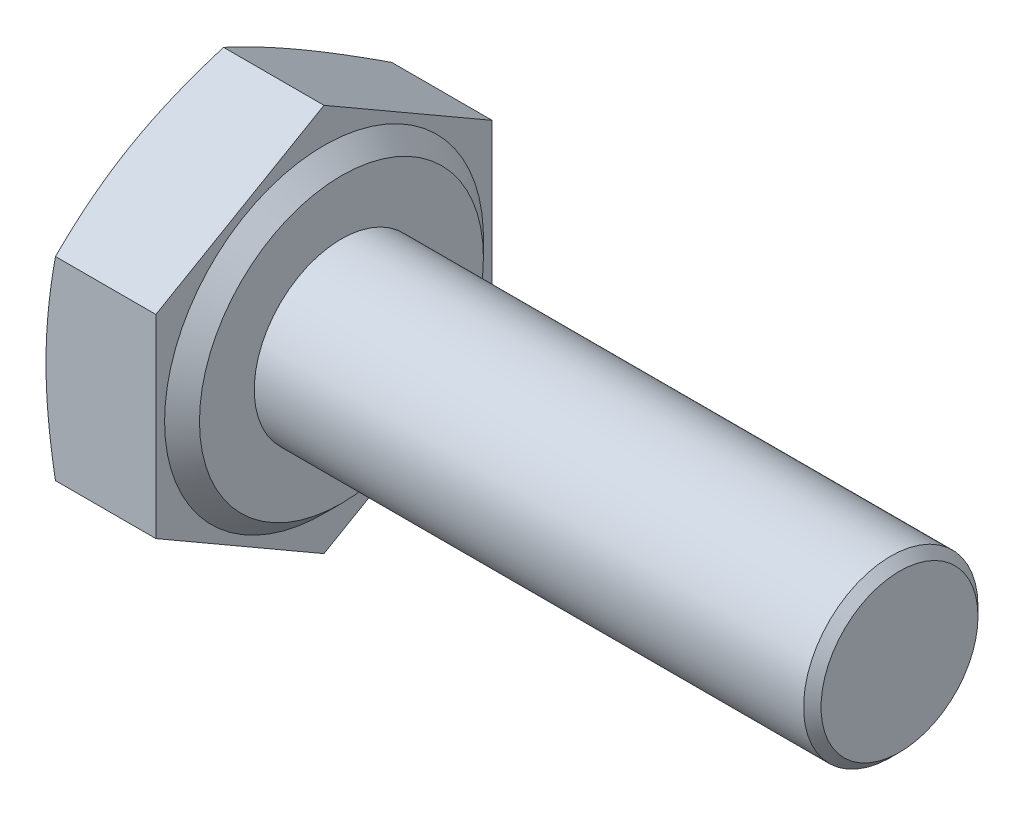
ISO-10303-21;
HEADER;
FILE_DESCRIPTION(('STEP AP214'),'2;1');
FILE_NAME('part.step','',(''),(''),'','','');
FILE_SCHEMA(('AUTOMOTIVE_DESIGN { 1 0 10303 214 1 1 1 1 }'));
ENDSEC;
DATA;
#1=APPLICATION_CONTEXT('core data for automotive mechanical design processes');
#2=APPLICATION_PROTOCOL_DEFINITION('international standard','automotive_design',2000,#1);
#3=PRODUCT_CONTEXT('',#1,'mechanical');
#4=PRODUCT('Part','Part','',(#3));
#5=PRODUCT_RELATED_PRODUCT_CATEGORY('part','',(#4));
#6=PRODUCT_DEFINITION_FORMATION('','',#4);
#7=PRODUCT_DEFINITION_CONTEXT('part definition',#1,'design');
#8=PRODUCT_DEFINITION('design','',#6,#7);
#9=PRODUCT_DEFINITION_SHAPE('','',#8);
#10=(LENGTH_UNIT() NAMED_UNIT(*) SI_UNIT(.MILLI.,.METRE.));
#11=(NAMED_UNIT(*) PLANE_ANGLE_UNIT() SI_UNIT($,.RADIAN.));
#12=(NAMED_UNIT(*) SI_UNIT($,.STERADIAN.) SOLID_ANGLE_UNIT());
#13=UNCERTAINTY_MEASURE_WITH_UNIT(LENGTH_MEASURE(1.E-05),#10,'distance_accuracy_value','');
#14=(GEOMETRIC_REPRESENTATION_CONTEXT(3) GLOBAL_UNCERTAINTY_ASSIGNED_CONTEXT((#13)) GLOBAL_UNIT_ASSIGNED_CONTEXT((#10,
#11,#12)) REPRESENTATION_CONTEXT('',''));
#15=CARTESIAN_POINT('',(0.,0.,0.));
#16=DIRECTION('',(0.,0.,1.));
#17=DIRECTION('',(1.,0.,0.));
#18=AXIS2_PLACEMENT_3D('',#15,#16,#17);
#19=CARTESIAN_POINT('',(1.825,-1.391414148747,-2.41));
#20=DIRECTION('',(1.,0.,0.));
#21=DIRECTION('',(0.,0.,-1.));
#22=AXIS2_PLACEMENT_3D('',#19,#20,#21);
#23=PLANE('',#22);
#24=CARTESIAN_POINT('',(1.825,0.,0.));
#25=DIRECTION('',(-1.,0.,0.));
#26=DIRECTION('',(0.,0.,1.));
#27=AXIS2_PLACEMENT_3D('',#24,#25,#26);
#28=CIRCLE('',#27,2.035);
#29=CARTESIAN_POINT('',(1.825,0.,2.035));
#30=VERTEX_POINT('',#29);
#31=EDGE_CURVE('E288',#30,#30,#28,.T.);
#32=ORIENTED_EDGE('',*,*,#31,.F.);
#33=EDGE_LOOP('',(#32));
#34=FACE_BOUND('',#33,.T.);
#35=CARTESIAN_POINT('',(1.825,0.,0.));
#36=DIRECTION('',(1.,0.,0.));
#37=DIRECTION('',(0.,0.,-1.));
#38=AXIS2_PLACEMENT_3D('',#35,#36,#37);
#39=CIRCLE('',#38,1.25);
#40=CARTESIAN_POINT('',(1.825,0.,-1.25));
#41=VERTEX_POINT('',#40);
#42=EDGE_CURVE('E296',#41,#41,#39,.T.);
#43=ORIENTED_EDGE('',*,*,#42,.F.);
#44=EDGE_LOOP('',(#43));
#45=FACE_BOUND('',#44,.T.);
#46=ADVANCED_FACE('F37',(#34,#45),#23,.T.);
#47=CARTESIAN_POINT('',(1.825,-2.782828297494,0.));
#48=DIRECTION('',(0.,0.866025403784439,0.5));
#49=DIRECTION('',(0.,-0.5,0.866025403784439));
#50=AXIS2_PLACEMENT_3D('',#47,#48,#49);
#51=PLANE('',#50);
#52=CARTESIAN_POINT('',(0.135740433058224,-1.39129867869316,-2.4102));
#53=CARTESIAN_POINT('',(0.11475495777836,-1.44892969610211,-2.31038014975582));
#54=CARTESIAN_POINT('',(0.0956649105607363,-1.50675077673671,-2.21023110034815));
#55=CARTESIAN_POINT('',(0.0620787721126977,-1.6227689600018,-2.00928171233119));
#56=CARTESIAN_POINT('',(0.0475862770157083,-1.68096632082732,-1.90848092651496));
#57=CARTESIAN_POINT('',(0.0241450259654417,-1.797091094461,-1.707346918564));
#58=CARTESIAN_POINT('',(0.0151451325515843,-1.85501585427782,-1.60701829154504));
#59=CARTESIAN_POINT('',(0.00307373147167732,-1.97100085644315,-1.40612637487869));
#60=CARTESIAN_POINT('',(0.,-2.02906103978183,-1.30556318743935));
#61=CARTESIAN_POINT('',(0.,-2.14518140645917,-1.10443681256065));
#62=CARTESIAN_POINT('',(0.00307373147167722,-2.20324158979785,-1.00387362512131));
#63=CARTESIAN_POINT('',(0.0151451325515843,-2.31922659196318,-0.802981708454963));
#64=CARTESIAN_POINT('',(0.0241450259654417,-2.37715135178,-0.702653081436003));
#65=CARTESIAN_POINT('',(0.0475862770157085,-2.49327612541368,-0.501519073485041));
#66=CARTESIAN_POINT('',(0.0620787721126978,-2.5514734862392,-0.400718287668812));
#67=CARTESIAN_POINT('',(0.0956649105607365,-2.66749166950428,-0.199768899651853));
#68=CARTESIAN_POINT('',(0.11475495777836,-2.72531275013889,-0.099619850244179));
#69=CARTESIAN_POINT('',(0.135740433058224,-2.78294376754784,0.000200000000000868));
#70=B_SPLINE_CURVE_WITH_KNOTS('',3,(#52,#53,#54,#55,#56,#57,#58,#59,#60,#61,#62,#63,#64,#65,#66,
#67,#68,#69),.UNSPECIFIED.,.F.,.F.,(4,2,2,2,2,2,2,2,4),(0.,0.351506811172691,0.703287891421606,
1.05174174717387,1.40006481936204,1.7483878915502,2.09684174730247,2.44862282755138,
2.80012963872407),.UNSPECIFIED.);
#71=CARTESIAN_POINT('',(0.135698402779957,-1.391414148747,-2.41));
#72=VERTEX_POINT('',#71);
#73=CARTESIAN_POINT('',(0.,-2.0871212231205,-1.205));
#74=VERTEX_POINT('',#73);
#75=EDGE_CURVE('E115',#72,#74,#70,.T.);
#76=ORIENTED_EDGE('',*,*,#75,.F.);
#77=DIRECTION('',(-1.,0.,0.));
#78=VECTOR('',#77,1.);
#79=CARTESIAN_POINT('',(1.825,-1.391414148747,-2.41));
#80=LINE('',#79,#78);
#81=CARTESIAN_POINT('',(1.575,-1.391414148747,-2.41));
#82=VERTEX_POINT('',#81);
#83=EDGE_CURVE('E144',#82,#72,#80,.T.);
#84=ORIENTED_EDGE('',*,*,#83,.F.);
#85=DIRECTION('',(0.,0.5,-0.866025403784439));
#86=VECTOR('',#85,1.);
#87=CARTESIAN_POINT('',(1.575,-2.782828297494,0.));
#88=LINE('',#87,#86);
#89=CARTESIAN_POINT('',(1.575,-2.782828297494,0.));
#90=VERTEX_POINT('',#89);
#91=EDGE_CURVE('E273',#90,#82,#88,.T.);
#92=ORIENTED_EDGE('',*,*,#91,.F.);
#93=DIRECTION('',(-1.,0.,0.));
#94=VECTOR('',#93,1.);
#95=CARTESIAN_POINT('',(1.825,-2.782828297494,0.));
#96=LINE('',#95,#94);
#97=CARTESIAN_POINT('',(0.135698402779957,-2.782828297494,0.));
#98=VERTEX_POINT('',#97);
#99=EDGE_CURVE('E138',#90,#98,#96,.T.);
#100=ORIENTED_EDGE('',*,*,#99,.T.);
#101=EDGE_CURVE('E168',#74,#98,#70,.T.);
#102=ORIENTED_EDGE('',*,*,#101,.F.);
#103=EDGE_LOOP('',(#76,#84,#92,#100,#102));
#104=FACE_BOUND('',#103,.T.);
#105=ADVANCED_FACE('F183',(#104),#51,.F.);
#106=CARTESIAN_POINT('',(1.825,-1.391414148747,-2.41));
#107=DIRECTION('',(0.,0.,1.));
#108=DIRECTION('',(1.,0.,0.));
#109=AXIS2_PLACEMENT_3D('',#106,#107,#108);
#110=PLANE('',#109);
#111=CARTESIAN_POINT('',(0.725118449395189,-3.68397541103632,-2.41));
#112=CARTESIAN_POINT('',(0.691916232197405,-3.57493826236735,-2.41));
#113=CARTESIAN_POINT('',(0.659102121100284,-3.46578099905647,-2.41));
#114=CARTESIAN_POINT('',(0.594463062521044,-3.24716497102925,-2.41));
#115=CARTESIAN_POINT('',(0.562638193311904,-3.13770618319719,-2.41));
#116=CARTESIAN_POINT('',(0.500137627974855,-2.9182384834956,-2.41));
#117=CARTESIAN_POINT('',(0.469464186700084,-2.80822892626066,-2.41));
#118=CARTESIAN_POINT('',(0.409632431370639,-2.58780097616611,-2.41));
#119=CARTESIAN_POINT('',(0.380474090111957,-2.47738259068526,-2.41));
#120=CARTESIAN_POINT('',(0.296492088804014,-2.14814022690301,-2.41));
#121=CARTESIAN_POINT('',(0.244371129606403,-1.92861379638917,-2.41));
#122=CARTESIAN_POINT('',(0.151484728591024,-1.48714341669105,-2.41));
#123=CARTESIAN_POINT('',(0.110714498866752,-1.26520052798119,-2.41));
#124=CARTESIAN_POINT('',(0.0641696067607395,-0.942929633412358,-2.41));
#125=CARTESIAN_POINT('',(0.0515408433248546,-0.84359294154322,-2.41));
#126=CARTESIAN_POINT('',(0.0301655451002474,-0.644507733033792,-2.41));
#127=CARTESIAN_POINT('',(0.0214185279129786,-0.544759269121795,-2.41));
#128=CARTESIAN_POINT('',(0.00822428799543366,-0.345040250399277,-2.41));
#129=CARTESIAN_POINT('',(0.00377422786066022,-0.245069885895629,-2.41));
#130=CARTESIAN_POINT('',(-0.000599632618072343,-0.0450290569932735,-2.41));
#131=CARTESIAN_POINT('',(-0.000523464925827476,0.0550414066935534,-2.41));
#132=CARTESIAN_POINT('',(0.00416262453057698,0.255580348418417,-2.41));
#133=CARTESIAN_POINT('',(0.00879545593826702,0.35604828220074,-2.41));
#134=CARTESIAN_POINT('',(0.0223820785581514,0.55669255580445,-2.41));
#135=CARTESIAN_POINT('',(0.0313361280323531,0.65686887783731,-2.41));
#136=CARTESIAN_POINT('',(0.0531452391923551,0.856875508901907,-2.41));
#137=CARTESIAN_POINT('',(0.0660035820186058,0.956705455193562,-2.41));
#138=CARTESIAN_POINT('',(0.0951032470303854,1.1558645767854,-2.41));
#139=CARTESIAN_POINT('',(0.111344587347389,1.25519374939872,-2.41));
#140=CARTESIAN_POINT('',(0.16619784536191,1.56289258023904,-2.41));
#141=CARTESIAN_POINT('',(0.209688553620053,1.77039003827092,-2.41));
#142=CARTESIAN_POINT('',(0.305040033571945,2.18345797478288,-2.41));
#143=CARTESIAN_POINT('',(0.356903819988952,2.38902773088139,-2.41));
#144=CARTESIAN_POINT('',(0.466211254341441,2.79894891337343,-2.41));
#145=CARTESIAN_POINT('',(0.523662035140416,3.00329841923893,-2.41));
#146=CARTESIAN_POINT('',(0.642259494800449,3.41087605095134,-2.41));
#147=CARTESIAN_POINT('',(0.703405587237117,3.61410434917033,-2.41));
#148=CARTESIAN_POINT('',(0.827565869995835,4.0175314782658,-2.41));
#149=CARTESIAN_POINT('',(0.890551990666702,4.21773898772082,-2.41));
#150=CARTESIAN_POINT('',(1.01831333910352,4.61759102111228,-2.41));
#151=CARTESIAN_POINT('',(1.08308865270908,4.817235517529,-2.41));
#152=CARTESIAN_POINT('',(1.21369513300691,5.21533887704352,-2.41));
#153=CARTESIAN_POINT('',(1.27952136084416,5.41379936454835,-2.41));
#154=CARTESIAN_POINT('',(1.41216077369734,5.81037235612901,-2.41));
#155=CARTESIAN_POINT('',(1.47897387697604,6.00848488752012,-2.41));
#156=CARTESIAN_POINT('',(1.54613224071265,6.20647862211173,-2.41));
#157=B_SPLINE_CURVE_WITH_KNOTS('',3,(#111,#112,#113,#114,#115,#116,#117,#118,#119,#120,#121,
#122,#123,#124,#125,#126,#127,#128,#129,#130,#131,#132,#133,#134,#135,#136,#137,#138,#139,#140,
#141,#142,#143,#144,#145,#146,#147,#148,#149,#150,#151,#152,#153,#154,#155,#156),.UNSPECIFIED.,
.F.,.F.,(4,2,2,2,2,2,2,2,2,2,2,2,2,2,2,2,2,2,2,2,2,2,4),(0.,0.34194254467835,0.683912076771967,
1.02651963861704,1.36912104672901,2.04584380108136,2.72228066972418,3.02262592336229,
3.32293384155769,3.62304332189978,3.92315068289714,4.22477465382139,4.52641665384296,
4.82831285659151,5.13021067742115,5.76592006074203,6.4018588435226,7.03862045696581,
7.67528128406269,8.30491470768854,8.93457839170694,9.56185291021376,10.1890757632936),.UNSPECIFIED.);
#158=CARTESIAN_POINT('',(0.135698402779957,1.391414148747,-2.41));
#159=VERTEX_POINT('',#158);
#160=CARTESIAN_POINT('',(0.,0.,-2.41));
#161=VERTEX_POINT('',#160);
#162=EDGE_CURVE('E233',#159,#161,#157,.F.);
#163=ORIENTED_EDGE('',*,*,#162,.F.);
#164=DIRECTION('',(-1.,0.,0.));
#165=VECTOR('',#164,1.);
#166=CARTESIAN_POINT('',(1.825,1.391414148747,-2.41));
#167=LINE('',#166,#165);
#168=CARTESIAN_POINT('',(1.575,1.391414148747,-2.41));
#169=VERTEX_POINT('',#168);
#170=EDGE_CURVE('E135',#169,#159,#167,.T.);
#171=ORIENTED_EDGE('',*,*,#170,.F.);
#172=DIRECTION('',(0.,1.,0.));
#173=VECTOR('',#172,1.);
#174=CARTESIAN_POINT('',(1.575,-1.391414148747,-2.41));
#175=LINE('',#174,#173);
#176=EDGE_CURVE('E275',#82,#169,#175,.T.);
#177=ORIENTED_EDGE('',*,*,#176,.F.);
#178=ORIENTED_EDGE('',*,*,#83,.T.);
#179=EDGE_CURVE('E126',#161,#72,#157,.F.);
#180=ORIENTED_EDGE('',*,*,#179,.F.);
#181=EDGE_LOOP('',(#163,#171,#177,#178,#180));
#182=FACE_BOUND('',#181,.T.);
#183=ADVANCED_FACE('F241',(#182),#110,.F.);
#184=CARTESIAN_POINT('',(1.825,1.391414148747,-2.41));
#185=DIRECTION('',(0.,-0.866025403784439,0.5));
#186=DIRECTION('',(0.,-0.5,-0.866025403784439));
#187=AXIS2_PLACEMENT_3D('',#184,#185,#186);
#188=PLANE('',#187);
#189=CARTESIAN_POINT('',(0.135740433058224,2.78294376754784,0.000200000000000052));
#190=CARTESIAN_POINT('',(0.114754957778361,2.72531275013889,-0.0996198502441798));
#191=CARTESIAN_POINT('',(0.0956649105607367,2.66749166950428,-0.199768899651854));
#192=CARTESIAN_POINT('',(0.0620787721126979,2.5514734862392,-0.400718287668813));
#193=CARTESIAN_POINT('',(0.0475862770157086,2.49327612541368,-0.501519073485042));
#194=CARTESIAN_POINT('',(0.024145025965442,2.37715135178,-0.702653081436003));
#195=CARTESIAN_POINT('',(0.0151451325515847,2.31922659196318,-0.802981708454963));
#196=CARTESIAN_POINT('',(0.00307373147167759,2.20324158979785,-1.00387362512131));
#197=CARTESIAN_POINT('',(0.,2.14518140645917,-1.10443681256065));
#198=CARTESIAN_POINT('',(0.,2.02906103978183,-1.30556318743935));
#199=CARTESIAN_POINT('',(0.00307373147167731,1.97100085644315,-1.40612637487869));
#200=CARTESIAN_POINT('',(0.0151451325515843,1.85501585427782,-1.60701829154504));
#201=CARTESIAN_POINT('',(0.0241450259654417,1.797091094461,-1.707346918564));
#202=CARTESIAN_POINT('',(0.0475862770157083,1.68096632082732,-1.90848092651496));
#203=CARTESIAN_POINT('',(0.0620787721126976,1.6227689600018,-2.00928171233119));
#204=CARTESIAN_POINT('',(0.0956649105607362,1.50675077673671,-2.21023110034815));
#205=CARTESIAN_POINT('',(0.11475495777836,1.44892969610211,-2.31038014975582));
#206=CARTESIAN_POINT('',(0.135740433058224,1.39129867869316,-2.4102));
#207=B_SPLINE_CURVE_WITH_KNOTS('',3,(#189,#190,#191,#192,#193,#194,#195,#196,#197,#198,#199,
#200,#201,#202,#203,#204,#205,#206),.UNSPECIFIED.,.F.,.F.,(4,2,2,2,2,2,2,2,4),(0.,
0.351506811172691,0.703287891421605,1.05174174717387,1.40006481936203,1.7483878915502,
2.09684174730247,2.44862282755138,2.80012963872407),.UNSPECIFIED.);
#208=CARTESIAN_POINT('',(0.135698402779957,2.782828297494,0.));
#209=VERTEX_POINT('',#208);
#210=CARTESIAN_POINT('',(0.,2.0871212231205,-1.205));
#211=VERTEX_POINT('',#210);
#212=EDGE_CURVE('E52',#209,#211,#207,.T.);
#213=ORIENTED_EDGE('',*,*,#212,.F.);
#214=DIRECTION('',(-1.,0.,0.));
#215=VECTOR('',#214,1.);
#216=CARTESIAN_POINT('',(1.825,2.782828297494,0.));
#217=LINE('',#216,#215);
#218=CARTESIAN_POINT('',(1.575,2.782828297494,0.));
#219=VERTEX_POINT('',#218);
#220=EDGE_CURVE('E132',#219,#209,#217,.T.);
#221=ORIENTED_EDGE('',*,*,#220,.F.);
#222=DIRECTION('',(0.,0.5,0.866025403784439));
#223=VECTOR('',#222,1.);
#224=CARTESIAN_POINT('',(1.575,1.391414148747,-2.41));
#225=LINE('',#224,#223);
#226=EDGE_CURVE('E281',#169,#219,#225,.T.);
#227=ORIENTED_EDGE('',*,*,#226,.F.);
#228=ORIENTED_EDGE('',*,*,#170,.T.);
#229=EDGE_CURVE('E234',#211,#159,#207,.T.);
#230=ORIENTED_EDGE('',*,*,#229,.F.);
#231=EDGE_LOOP('',(#213,#221,#227,#228,#230));
#232=FACE_BOUND('',#231,.T.);
#233=ADVANCED_FACE('F244',(#232),#188,.F.);
#234=CARTESIAN_POINT('',(1.825,2.782828297494,0.));
#235=DIRECTION('',(0.,-0.866025403784439,-0.5));
#236=DIRECTION('',(0.,0.5,-0.866025403784439));
#237=AXIS2_PLACEMENT_3D('',#234,#235,#236);
#238=PLANE('',#237);
#239=CARTESIAN_POINT('',(0.135740433058224,1.39129867869316,2.4102));
#240=CARTESIAN_POINT('',(0.11475495777836,1.44892969610211,2.31038014975582));
#241=CARTESIAN_POINT('',(0.0956649105607365,1.50675077673671,2.21023110034815));
#242=CARTESIAN_POINT('',(0.0620787721126977,1.62276896000179,2.00928171233119));
#243=CARTESIAN_POINT('',(0.0475862770157083,1.68096632082732,1.90848092651496));
#244=CARTESIAN_POINT('',(0.0241450259654417,1.797091094461,1.707346918564));
#245=CARTESIAN_POINT('',(0.0151451325515844,1.85501585427782,1.60701829154504));
#246=CARTESIAN_POINT('',(0.00307373147167749,1.97100085644315,1.40612637487869));
#247=CARTESIAN_POINT('',(0.,2.02906103978183,1.30556318743935));
#248=CARTESIAN_POINT('',(0.,2.14518140645917,1.10443681256065));
#249=CARTESIAN_POINT('',(0.00307373147167739,2.20324158979785,1.00387362512131));
#250=CARTESIAN_POINT('',(0.0151451325515845,2.31922659196318,0.802981708454964));
#251=CARTESIAN_POINT('',(0.024145025965442,2.37715135178,0.702653081436004));
#252=CARTESIAN_POINT('',(0.0475862770157087,2.49327612541368,0.501519073485042));
#253=CARTESIAN_POINT('',(0.062078772112698,2.5514734862392,0.400718287668813));
#254=CARTESIAN_POINT('',(0.0956649105607367,2.66749166950428,0.199768899651854));
#255=CARTESIAN_POINT('',(0.114754957778361,2.72531275013889,0.0996198502441798));
#256=CARTESIAN_POINT('',(0.135740433058225,2.78294376754784,-0.000200000000000095));
#257=B_SPLINE_CURVE_WITH_KNOTS('',3,(#239,#240,#241,#242,#243,#244,#245,#246,#247,#248,#249,
#250,#251,#252,#253,#254,#255,#256),.UNSPECIFIED.,.F.,.F.,(4,2,2,2,2,2,2,2,4),(0.,
0.351506811172691,0.703287891421606,1.05174174717387,1.40006481936204,1.7483878915502,
2.09684174730247,2.44862282755138,2.80012963872407),.UNSPECIFIED.);
#258=CARTESIAN_POINT('',(0.135698402779957,1.391414148747,2.41));
#259=VERTEX_POINT('',#258);
#260=CARTESIAN_POINT('',(0.,2.0871212231205,1.205));
#261=VERTEX_POINT('',#260);
#262=EDGE_CURVE('E60',#259,#261,#257,.T.);
#263=ORIENTED_EDGE('',*,*,#262,.F.);
#264=DIRECTION('',(-1.,0.,0.));
#265=VECTOR('',#264,1.);
#266=CARTESIAN_POINT('',(1.825,1.391414148747,2.41));
#267=LINE('',#266,#265);
#268=CARTESIAN_POINT('',(1.575,1.391414148747,2.41));
#269=VERTEX_POINT('',#268);
#270=EDGE_CURVE('E123',#269,#259,#267,.T.);
#271=ORIENTED_EDGE('',*,*,#270,.F.);
#272=DIRECTION('',(0.,-0.5,0.866025403784439));
#273=VECTOR('',#272,1.);
#274=CARTESIAN_POINT('',(1.575,2.782828297494,0.));
#275=LINE('',#274,#273);
#276=EDGE_CURVE('E283',#219,#269,#275,.T.);
#277=ORIENTED_EDGE('',*,*,#276,.F.);
#278=ORIENTED_EDGE('',*,*,#220,.T.);
#279=EDGE_CURVE('E125',#261,#209,#257,.T.);
#280=ORIENTED_EDGE('',*,*,#279,.F.);
#281=EDGE_LOOP('',(#263,#271,#277,#278,#280));
#282=FACE_BOUND('',#281,.T.);
#283=ADVANCED_FACE('F121',(#282),#238,.F.);
#284=CARTESIAN_POINT('',(1.825,1.391414148747,2.41));
#285=DIRECTION('',(0.,0.,-1.));
#286=DIRECTION('',(-1.,0.,0.));
#287=AXIS2_PLACEMENT_3D('',#284,#285,#286);
#288=PLANE('',#287);
#289=CARTESIAN_POINT('',(0.725118449395189,-3.68397541103632,2.41));
#290=CARTESIAN_POINT('',(0.691916232197405,-3.57493826236735,2.41));
#291=CARTESIAN_POINT('',(0.659102121100284,-3.46578099905647,2.41));
#292=CARTESIAN_POINT('',(0.594463062521043,-3.24716497102925,2.41));
#293=CARTESIAN_POINT('',(0.562638193311904,-3.13770618319719,2.41));
#294=CARTESIAN_POINT('',(0.500137627974854,-2.9182384834956,2.41));
#295=CARTESIAN_POINT('',(0.469464186700084,-2.80822892626066,2.41));
#296=CARTESIAN_POINT('',(0.409632431370638,-2.58780097616611,2.41));
#297=CARTESIAN_POINT('',(0.380474090111957,-2.47738259068526,2.41));
#298=CARTESIAN_POINT('',(0.296492088804014,-2.14814022690301,2.41));
#299=CARTESIAN_POINT('',(0.244371129606403,-1.92861379638917,2.41));
#300=CARTESIAN_POINT('',(0.151484728591024,-1.48714341669105,2.41));
#301=CARTESIAN_POINT('',(0.110714498866752,-1.26520052798119,2.41));
#302=CARTESIAN_POINT('',(0.0641696067607397,-0.942929633412356,2.41));
#303=CARTESIAN_POINT('',(0.0515408433248547,-0.843592941543219,2.41));
#304=CARTESIAN_POINT('',(0.0301655451002476,-0.644507733033791,2.41));
#305=CARTESIAN_POINT('',(0.021418527912979,-0.544759269121794,2.41));
#306=CARTESIAN_POINT('',(0.00822428799543398,-0.345040250399276,2.41));
#307=CARTESIAN_POINT('',(0.00377422786066043,-0.245069885895629,2.41));
#308=CARTESIAN_POINT('',(-0.000599632618072238,-0.0450290569932729,2.41));
#309=CARTESIAN_POINT('',(-0.000523464925827365,0.0550414066935539,2.41));
#310=CARTESIAN_POINT('',(0.00416262453057719,0.255580348418417,2.41));
#311=CARTESIAN_POINT('',(0.00879545593826732,0.356048282200741,2.41));
#312=CARTESIAN_POINT('',(0.0223820785581517,0.556692555804451,2.41));
#313=CARTESIAN_POINT('',(0.0313361280323534,0.65686887783731,2.41));
#314=CARTESIAN_POINT('',(0.0531452391923555,0.856875508901908,2.41));
#315=CARTESIAN_POINT('',(0.0660035820186062,0.956705455193564,2.41));
#316=CARTESIAN_POINT('',(0.0951032470303859,1.1558645767854,2.41));
#317=CARTESIAN_POINT('',(0.11134458734739,1.25519374939872,2.41));
#318=CARTESIAN_POINT('',(0.16619784536191,1.56289258023904,2.41));
#319=CARTESIAN_POINT('',(0.209688553620054,1.77039003827092,2.41));
#320=CARTESIAN_POINT('',(0.305040033571946,2.18345797478288,2.41));
#321=CARTESIAN_POINT('',(0.356903819988953,2.38902773088139,2.41));
#322=CARTESIAN_POINT('',(0.466211254341441,2.79894891337343,2.41));
#323=CARTESIAN_POINT('',(0.523662035140416,3.00329841923893,2.41));
#324=CARTESIAN_POINT('',(0.64225949480045,3.41087605095134,2.41));
#325=CARTESIAN_POINT('',(0.703405587237118,3.61410434917034,2.41));
#326=CARTESIAN_POINT('',(0.827565869995835,4.0175314782658,2.41));
#327=CARTESIAN_POINT('',(0.890551990666702,4.21773898772082,2.41));
#328=CARTESIAN_POINT('',(1.01831333910352,4.61759102111228,2.41));
#329=CARTESIAN_POINT('',(1.08308865270908,4.817235517529,2.41));
#330=CARTESIAN_POINT('',(1.21369513300691,5.21533887704352,2.41));
#331=CARTESIAN_POINT('',(1.27952136084416,5.41379936454835,2.41));
#332=CARTESIAN_POINT('',(1.41216077369734,5.810372356129,2.41));
#333=CARTESIAN_POINT('',(1.47897387697604,6.00848488752012,2.41));
#334=CARTESIAN_POINT('',(1.54613224071265,6.20647862211172,2.41));
#335=B_SPLINE_CURVE_WITH_KNOTS('',3,(#289,#290,#291,#292,#293,#294,#295,#296,#297,#298,#299,
#300,#301,#302,#303,#304,#305,#306,#307,#308,#309,#310,#311,#312,#313,#314,#315,#316,#317,#318,
#319,#320,#321,#322,#323,#324,#325,#326,#327,#328,#329,#330,#331,#332,#333,#334),.UNSPECIFIED.,
.F.,.F.,(4,2,2,2,2,2,2,2,2,2,2,2,2,2,2,2,2,2,2,2,2,2,4),(0.,0.341942544678351,0.683912076771969,
1.02651963861704,1.36912104672901,2.04584380108136,2.72228066972418,3.0226259233623,
3.32293384155769,3.62304332189978,3.92315068289714,4.22477465382139,4.52641665384296,
4.82831285659151,5.13021067742116,5.76592006074203,6.4018588435226,7.03862045696581,
7.67528128406269,8.30491470768854,8.93457839170694,9.56185291021376,10.1890757632936),.UNSPECIFIED.);
#336=CARTESIAN_POINT('',(0.135698402779957,-1.391414148747,2.41));
#337=VERTEX_POINT('',#336);
#338=CARTESIAN_POINT('',(0.,0.,2.41));
#339=VERTEX_POINT('',#338);
#340=EDGE_CURVE('E117',#337,#339,#335,.T.);
#341=ORIENTED_EDGE('',*,*,#340,.F.);
#342=DIRECTION('',(-1.,0.,0.));
#343=VECTOR('',#342,1.);
#344=CARTESIAN_POINT('',(1.825,-1.391414148747,2.41));
#345=LINE('',#344,#343);
#346=CARTESIAN_POINT('',(1.575,-1.391414148747,2.41));
#347=VERTEX_POINT('',#346);
#348=EDGE_CURVE('E133',#347,#337,#345,.T.);
#349=ORIENTED_EDGE('',*,*,#348,.F.);
#350=DIRECTION('',(0.,-1.,0.));
#351=VECTOR('',#350,1.);
#352=CARTESIAN_POINT('',(1.575,1.391414148747,2.41));
#353=LINE('',#352,#351);
#354=EDGE_CURVE('E131',#269,#347,#353,.T.);
#355=ORIENTED_EDGE('',*,*,#354,.F.);
#356=ORIENTED_EDGE('',*,*,#270,.T.);
#357=EDGE_CURVE('E107',#339,#259,#335,.T.);
#358=ORIENTED_EDGE('',*,*,#357,.F.);
#359=EDGE_LOOP('',(#341,#349,#355,#356,#358));
#360=FACE_BOUND('',#359,.T.);
#361=ADVANCED_FACE('F129',(#360),#288,.F.);
#362=CARTESIAN_POINT('',(1.825,-1.391414148747,2.41));
#363=DIRECTION('',(0.,0.866025403784439,-0.5));
#364=DIRECTION('',(0.,0.5,0.866025403784439));
#365=AXIS2_PLACEMENT_3D('',#362,#363,#364);
#366=PLANE('',#365);
#367=CARTESIAN_POINT('',(0.135740433058224,-2.78294376754784,-0.000199999999999248));
#368=CARTESIAN_POINT('',(0.11475495777836,-2.72531275013889,0.0996198502441808));
#369=CARTESIAN_POINT('',(0.0956649105607363,-2.66749166950428,0.199768899651855));
#370=CARTESIAN_POINT('',(0.0620787721126976,-2.5514734862392,0.400718287668814));
#371=CARTESIAN_POINT('',(0.0475862770157083,-2.49327612541368,0.501519073485043));
#372=CARTESIAN_POINT('',(0.0241450259654417,-2.37715135178,0.702653081436005));
#373=CARTESIAN_POINT('',(0.0151451325515844,-2.31922659196318,0.802981708454964));
#374=CARTESIAN_POINT('',(0.00307373147167732,-2.20324158979785,1.00387362512131));
#375=CARTESIAN_POINT('',(0.,-2.14518140645917,1.10443681256065));
#376=CARTESIAN_POINT('',(0.,-2.02906103978182,1.30556318743935));
#377=CARTESIAN_POINT('',(0.00307373147167729,-1.97100085644315,1.40612637487869));
#378=CARTESIAN_POINT('',(0.0151451325515843,-1.85501585427782,1.60701829154504));
#379=CARTESIAN_POINT('',(0.0241450259654416,-1.797091094461,1.707346918564));
#380=CARTESIAN_POINT('',(0.0475862770157082,-1.68096632082732,1.90848092651496));
#381=CARTESIAN_POINT('',(0.0620787721126976,-1.62276896000179,2.00928171233119));
#382=CARTESIAN_POINT('',(0.0956649105607364,-1.50675077673671,2.21023110034815));
#383=CARTESIAN_POINT('',(0.11475495777836,-1.44892969610211,2.31038014975582));
#384=CARTESIAN_POINT('',(0.135740433058224,-1.39129867869316,2.4102));
#385=B_SPLINE_CURVE_WITH_KNOTS('',3,(#367,#368,#369,#370,#371,#372,#373,#374,#375,#376,#377,
#378,#379,#380,#381,#382,#383,#384),.UNSPECIFIED.,.F.,.F.,(4,2,2,2,2,2,2,2,4),(0.,
0.35150681117269,0.703287891421605,1.05174174717387,1.40006481936204,1.7483878915502,
2.09684174730247,2.44862282755138,2.80012963872407),.UNSPECIFIED.);
#386=CARTESIAN_POINT('',(0.,-2.0871212231205,1.205));
#387=VERTEX_POINT('',#386);
#388=EDGE_CURVE('E170',#98,#387,#385,.T.);
#389=ORIENTED_EDGE('',*,*,#388,.F.);
#390=ORIENTED_EDGE('',*,*,#99,.F.);
#391=DIRECTION('',(0.,-0.5,-0.866025403784439));
#392=VECTOR('',#391,1.);
#393=CARTESIAN_POINT('',(1.575,-1.391414148747,2.41));
#394=LINE('',#393,#392);
#395=EDGE_CURVE('E147',#347,#90,#394,.T.);
#396=ORIENTED_EDGE('',*,*,#395,.F.);
#397=ORIENTED_EDGE('',*,*,#348,.T.);
#398=EDGE_CURVE('E218',#387,#337,#385,.T.);
#399=ORIENTED_EDGE('',*,*,#398,.F.);
#400=EDGE_LOOP('',(#389,#390,#396,#397,#399));
#401=FACE_BOUND('',#400,.T.);
#402=ADVANCED_FACE('F253',(#401),#366,.F.);
#403=CARTESIAN_POINT('',(1.575,2.285,0.));
#404=DIRECTION('',(1.,0.,0.));
#405=DIRECTION('',(0.,0.,-1.));
#406=AXIS2_PLACEMENT_3D('',#403,#404,#405);
#407=PLANE('',#406);
#408=CARTESIAN_POINT('',(1.575,0.,0.));
#409=DIRECTION('',(-1.,0.,0.));
#410=DIRECTION('',(0.,0.,1.));
#411=AXIS2_PLACEMENT_3D('',#408,#409,#410);
#412=CIRCLE('',#411,2.285);
#413=CARTESIAN_POINT('',(1.575,0.,2.285));
#414=VERTEX_POINT('',#413);
#415=EDGE_CURVE('E272',#414,#414,#412,.T.);
#416=ORIENTED_EDGE('',*,*,#415,.T.);
#417=EDGE_LOOP('',(#416));
#418=FACE_BOUND('',#417,.T.);
#419=ORIENTED_EDGE('',*,*,#91,.T.);
#420=ORIENTED_EDGE('',*,*,#176,.T.);
#421=ORIENTED_EDGE('',*,*,#226,.T.);
#422=ORIENTED_EDGE('',*,*,#276,.T.);
#423=ORIENTED_EDGE('',*,*,#354,.T.);
#424=ORIENTED_EDGE('',*,*,#395,.T.);
#425=EDGE_LOOP('',(#419,#420,#421,#422,#423,#424));
#426=FACE_BOUND('',#425,.T.);
#427=ADVANCED_FACE('F257',(#418,#426),#407,.T.);
#428=CARTESIAN_POINT('',(1.575,0.,0.));
#429=DIRECTION('',(-1.,0.,0.));
#430=DIRECTION('',(0.,0.,1.));
#431=AXIS2_PLACEMENT_3D('',#428,#429,#430);
#432=CONICAL_SURFACE('',#431,2.285,0.785398163397453);
#433=ORIENTED_EDGE('',*,*,#31,.T.);
#434=EDGE_LOOP('',(#433));
#435=FACE_BOUND('',#434,.T.);
#436=ORIENTED_EDGE('',*,*,#415,.F.);
#437=EDGE_LOOP('',(#436));
#438=FACE_BOUND('',#437,.T.);
#439=ADVANCED_FACE('F214',(#435,#438),#432,.T.);
#440=CARTESIAN_POINT('',(0.,0.,0.));
#441=DIRECTION('',(1.,0.,0.));
#442=DIRECTION('',(0.,0.,-1.));
#443=AXIS2_PLACEMENT_3D('',#440,#441,#442);
#444=CONICAL_SURFACE('',#443,2.41,1.22173047639604);
#445=ORIENTED_EDGE('',*,*,#179,.T.);
#446=ORIENTED_EDGE('',*,*,#75,.T.);
#447=CARTESIAN_POINT('',(0.,0.,0.));
#448=DIRECTION('',(1.,0.,0.));
#449=DIRECTION('',(0.,0.,-1.));
#450=AXIS2_PLACEMENT_3D('',#447,#448,#449);
#451=CIRCLE('',#450,2.41);
#452=EDGE_CURVE('E149',#74,#161,#451,.T.);
#453=ORIENTED_EDGE('',*,*,#452,.T.);
#454=EDGE_LOOP('',(#445,#446,#453));
#455=FACE_BOUND('',#454,.T.);
#456=ADVANCED_FACE('F176',(#455),#444,.T.);
#457=ORIENTED_EDGE('',*,*,#101,.T.);
#458=ORIENTED_EDGE('',*,*,#388,.T.);
#459=EDGE_CURVE('E151',#387,#74,#451,.T.);
#460=ORIENTED_EDGE('',*,*,#459,.T.);
#461=EDGE_LOOP('',(#457,#458,#460));
#462=FACE_BOUND('',#461,.T.);
#463=ADVANCED_FACE('F166',(#462),#444,.T.);
#464=ORIENTED_EDGE('',*,*,#340,.T.);
#465=EDGE_CURVE('E160',#339,#387,#451,.T.);
#466=ORIENTED_EDGE('',*,*,#465,.T.);
#467=ORIENTED_EDGE('',*,*,#398,.T.);
#468=EDGE_LOOP('',(#464,#466,#467));
#469=FACE_BOUND('',#468,.T.);
#470=ADVANCED_FACE('F211',(#469),#444,.T.);
#471=ORIENTED_EDGE('',*,*,#262,.T.);
#472=CARTESIAN_POINT('',(0.,0.,0.));
#473=DIRECTION('',(-1.,0.,0.));
#474=DIRECTION('',(0.,0.,1.));
#475=AXIS2_PLACEMENT_3D('',#472,#473,#474);
#476=CIRCLE('',#475,2.41);
#477=EDGE_CURVE('E110',#339,#261,#476,.T.);
#478=ORIENTED_EDGE('',*,*,#477,.F.);
#479=ORIENTED_EDGE('',*,*,#357,.T.);
#480=EDGE_LOOP('',(#471,#478,#479));
#481=FACE_BOUND('',#480,.T.);
#482=ADVANCED_FACE('F108',(#481),#444,.T.);
#483=ORIENTED_EDGE('',*,*,#212,.T.);
#484=EDGE_CURVE('E156',#211,#261,#451,.T.);
#485=ORIENTED_EDGE('',*,*,#484,.T.);
#486=ORIENTED_EDGE('',*,*,#279,.T.);
#487=EDGE_LOOP('',(#483,#485,#486));
#488=FACE_BOUND('',#487,.T.);
#489=ADVANCED_FACE('F205',(#488),#444,.T.);
#490=ORIENTED_EDGE('',*,*,#229,.T.);
#491=ORIENTED_EDGE('',*,*,#162,.T.);
#492=EDGE_CURVE('E152',#161,#211,#451,.T.);
#493=ORIENTED_EDGE('',*,*,#492,.T.);
#494=EDGE_LOOP('',(#490,#491,#493));
#495=FACE_BOUND('',#494,.T.);
#496=ADVANCED_FACE('F210',(#495),#444,.T.);
#497=CARTESIAN_POINT('',(0.,-1.391414148747,-2.41));
#498=DIRECTION('',(1.,0.,0.));
#499=DIRECTION('',(0.,0.,-1.));
#500=AXIS2_PLACEMENT_3D('',#497,#498,#499);
#501=PLANE('',#500);
#502=ORIENTED_EDGE('',*,*,#492,.F.);
#503=ORIENTED_EDGE('',*,*,#452,.F.);
#504=ORIENTED_EDGE('',*,*,#459,.F.);
#505=ORIENTED_EDGE('',*,*,#465,.F.);
#506=ORIENTED_EDGE('',*,*,#477,.T.);
#507=ORIENTED_EDGE('',*,*,#484,.F.);
#508=EDGE_LOOP('',(#502,#503,#504,#505,#506,#507));
#509=FACE_BOUND('',#508,.T.);
#510=ADVANCED_FACE('F181',(#509),#501,.F.);
#511=CARTESIAN_POINT('',(9.825,0.,0.));
#512=DIRECTION('',(-1.,0.,0.));
#513=DIRECTION('',(0.,0.,1.));
#514=AXIS2_PLACEMENT_3D('',#511,#512,#513);
#515=CYLINDRICAL_SURFACE('',#514,1.25);
#516=CARTESIAN_POINT('',(9.7,0.,0.));
#517=DIRECTION('',(1.,0.,0.));
#518=DIRECTION('',(0.,0.,-1.));
#519=AXIS2_PLACEMENT_3D('',#516,#517,#518);
#520=CIRCLE('',#519,1.25);
#521=CARTESIAN_POINT('',(9.7,0.,-1.25));
#522=VERTEX_POINT('',#521);
#523=EDGE_CURVE('E11',#522,#522,#520,.F.);
#524=ORIENTED_EDGE('',*,*,#523,.T.);
#525=EDGE_LOOP('',(#524));
#526=FACE_BOUND('',#525,.T.);
#527=ORIENTED_EDGE('',*,*,#42,.T.);
#528=EDGE_LOOP('',(#527));
#529=FACE_BOUND('',#528,.T.);
#530=ADVANCED_FACE('F212',(#526,#529),#515,.T.);
#531=CARTESIAN_POINT('',(9.825,0.,0.));
#532=DIRECTION('',(1.,0.,0.));
#533=DIRECTION('',(0.,0.,-1.));
#534=AXIS2_PLACEMENT_3D('',#531,#532,#533);
#535=PLANE('',#534);
#536=CARTESIAN_POINT('',(9.825,0.,0.));
#537=DIRECTION('',(1.,0.,0.));
#538=DIRECTION('',(0.,0.,-1.));
#539=AXIS2_PLACEMENT_3D('',#536,#537,#538);
#540=CIRCLE('',#539,1.125);
#541=CARTESIAN_POINT('',(9.825,0.,-1.125));
#542=VERTEX_POINT('',#541);
#543=EDGE_CURVE('E45',#542,#542,#540,.T.);
#544=ORIENTED_EDGE('',*,*,#543,.T.);
#545=EDGE_LOOP('',(#544));
#546=FACE_BOUND('',#545,.T.);
#547=ADVANCED_FACE('F303',(#546),#535,.T.);
#548=CARTESIAN_POINT('',(9.825,0.,0.));
#549=DIRECTION('',(-1.,0.,0.));
#550=DIRECTION('',(0.,0.,1.));
#551=AXIS2_PLACEMENT_3D('',#548,#549,#550);
#552=CONICAL_SURFACE('',#551,1.125,0.785398163397444);
#553=ORIENTED_EDGE('',*,*,#523,.F.);
#554=EDGE_LOOP('',(#553));
#555=FACE_BOUND('',#554,.T.);
#556=ORIENTED_EDGE('',*,*,#543,.F.);
#557=EDGE_LOOP('',(#556));
#558=FACE_BOUND('',#557,.T.);
#559=ADVANCED_FACE('F39',(#555,#558),#552,.T.);
#560=CLOSED_SHELL('',(#46,#105,#183,#233,#283,#361,#402,#427,#439,#456,#463,#470,#482,#489,#496,
#510,#530,#547,#559));
#561=MANIFOLD_SOLID_BREP('B2',#560);
#562=ADVANCED_BREP_SHAPE_REPRESENTATION('',(#18,#561),#14);
#563=SHAPE_DEFINITION_REPRESENTATION(#9,#562);
ENDSEC;
END-ISO-10303-21;
